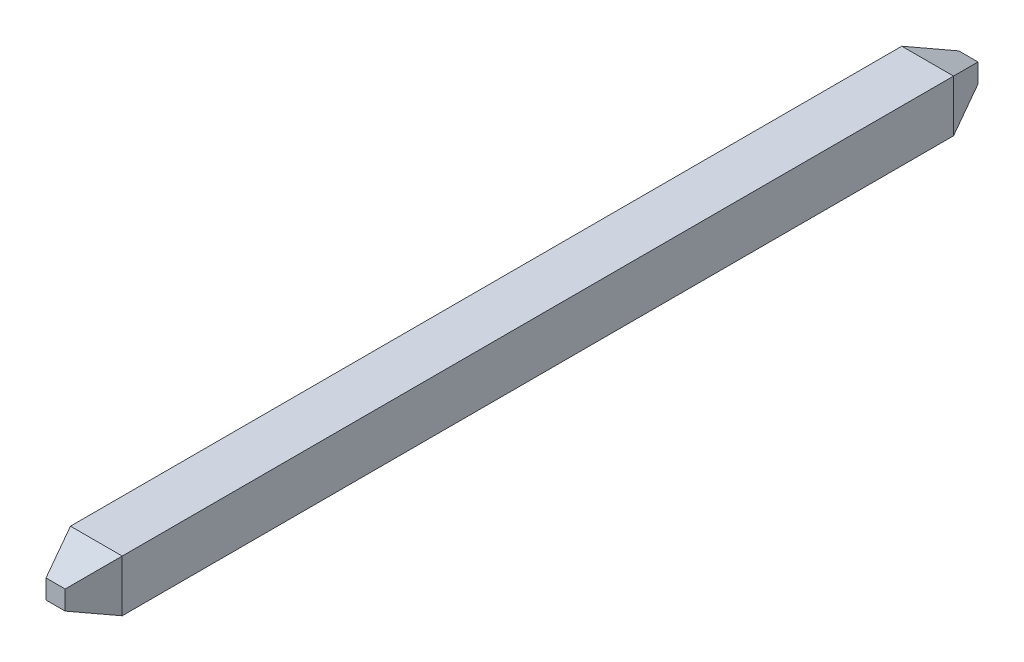
ISO-10303-21;
HEADER;
FILE_DESCRIPTION(('STEP AP214'),'2;1');
FILE_NAME('part.step','',(''),(''),'','','');
FILE_SCHEMA(('AUTOMOTIVE_DESIGN { 1 0 10303 214 1 1 1 1 }'));
ENDSEC;
DATA;
#1=APPLICATION_CONTEXT('core data for automotive mechanical design processes');
#2=APPLICATION_PROTOCOL_DEFINITION('international standard','automotive_design',2000,#1);
#3=PRODUCT_CONTEXT('',#1,'mechanical');
#4=PRODUCT('Part','Part','',(#3));
#5=PRODUCT_RELATED_PRODUCT_CATEGORY('part','',(#4));
#6=PRODUCT_DEFINITION_FORMATION('','',#4);
#7=PRODUCT_DEFINITION_CONTEXT('part definition',#1,'design');
#8=PRODUCT_DEFINITION('design','',#6,#7);
#9=PRODUCT_DEFINITION_SHAPE('','',#8);
#10=(LENGTH_UNIT() NAMED_UNIT(*) SI_UNIT(.MILLI.,.METRE.));
#11=(NAMED_UNIT(*) PLANE_ANGLE_UNIT() SI_UNIT($,.RADIAN.));
#12=(NAMED_UNIT(*) SI_UNIT($,.STERADIAN.) SOLID_ANGLE_UNIT());
#13=UNCERTAINTY_MEASURE_WITH_UNIT(LENGTH_MEASURE(1.E-05),#10,'distance_accuracy_value','');
#14=(GEOMETRIC_REPRESENTATION_CONTEXT(3) GLOBAL_UNCERTAINTY_ASSIGNED_CONTEXT((#13)) GLOBAL_UNIT_ASSIGNED_CONTEXT((#10,
#11,#12)) REPRESENTATION_CONTEXT('',''));
#15=CARTESIAN_POINT('',(0.,0.,0.));
#16=DIRECTION('',(0.,0.,1.));
#17=DIRECTION('',(1.,0.,0.));
#18=AXIS2_PLACEMENT_3D('',#15,#16,#17);
#19=CARTESIAN_POINT('',(0.3175,-0.2175,10.95));
#20=DIRECTION('',(0.,-0.928476690885259,0.371390676354104));
#21=DIRECTION('',(0.,-0.371390676354104,-0.928476690885259));
#22=AXIS2_PLACEMENT_3D('',#19,#20,#21);
#23=PLANE('',#22);
#24=DIRECTION('',(1.,0.,0.));
#25=VECTOR('',#24,1.);
#26=CARTESIAN_POINT('',(0.3175,-0.3175,10.7));
#27=LINE('',#26,#25);
#28=CARTESIAN_POINT('',(0.3175,-0.3175,10.7));
#29=VERTEX_POINT('',#28);
#30=CARTESIAN_POINT('',(-0.3175,-0.3175,10.7));
#31=VERTEX_POINT('',#30);
#32=EDGE_CURVE('E105',#29,#31,#27,.F.);
#33=ORIENTED_EDGE('',*,*,#32,.F.);
#34=DIRECTION('',(0.348155311911396,-0.348155311911395,-0.870388279778489));
#35=VECTOR('',#34,1.);
#36=CARTESIAN_POINT('',(0.1175,-0.1175,11.2));
#37=LINE('',#36,#35);
#38=CARTESIAN_POINT('',(0.1175,-0.1175,11.2));
#39=VERTEX_POINT('',#38);
#40=EDGE_CURVE('E86',#39,#29,#37,.T.);
#41=ORIENTED_EDGE('',*,*,#40,.F.);
#42=DIRECTION('',(1.,0.,0.));
#43=VECTOR('',#42,1.);
#44=CARTESIAN_POINT('',(0.,-0.1175,11.2));
#45=LINE('',#44,#43);
#46=CARTESIAN_POINT('',(-0.1175,-0.1175,11.2));
#47=VERTEX_POINT('',#46);
#48=EDGE_CURVE('E20',#47,#39,#45,.T.);
#49=ORIENTED_EDGE('',*,*,#48,.F.);
#50=DIRECTION('',(0.348155311911396,0.348155311911395,0.870388279778489));
#51=VECTOR('',#50,1.);
#52=CARTESIAN_POINT('',(-0.3175,-0.3175,10.7));
#53=LINE('',#52,#51);
#54=EDGE_CURVE('E83',#31,#47,#53,.T.);
#55=ORIENTED_EDGE('',*,*,#54,.F.);
#56=EDGE_LOOP('',(#33,#41,#49,#55));
#57=FACE_BOUND('',#56,.T.);
#58=ADVANCED_FACE('F17',(#57),#23,.T.);
#59=CARTESIAN_POINT('',(0.3175,-0.2175,0.25));
#60=DIRECTION('',(0.,0.928476690885259,0.371390676354104));
#61=DIRECTION('',(0.,-0.371390676354104,0.928476690885259));
#62=AXIS2_PLACEMENT_3D('',#59,#60,#61);
#63=PLANE('',#62);
#64=DIRECTION('',(1.,0.,0.));
#65=VECTOR('',#64,1.);
#66=CARTESIAN_POINT('',(0.3175,-0.3175,0.5));
#67=LINE('',#66,#65);
#68=CARTESIAN_POINT('',(-0.3175,-0.3175,0.5));
#69=VERTEX_POINT('',#68);
#70=CARTESIAN_POINT('',(0.3175,-0.3175,0.5));
#71=VERTEX_POINT('',#70);
#72=EDGE_CURVE('E107',#69,#71,#67,.T.);
#73=ORIENTED_EDGE('',*,*,#72,.F.);
#74=DIRECTION('',(0.348155311911396,0.348155311911396,-0.870388279778489));
#75=VECTOR('',#74,1.);
#76=CARTESIAN_POINT('',(-0.3175,-0.3175,0.5));
#77=LINE('',#76,#75);
#78=CARTESIAN_POINT('',(-0.1175,-0.1175,0.));
#79=VERTEX_POINT('',#78);
#80=EDGE_CURVE('E119',#69,#79,#77,.T.);
#81=ORIENTED_EDGE('',*,*,#80,.T.);
#82=DIRECTION('',(1.,0.,0.));
#83=VECTOR('',#82,1.);
#84=CARTESIAN_POINT('',(0.,-0.1175,0.));
#85=LINE('',#84,#83);
#86=CARTESIAN_POINT('',(0.1175,-0.1175,0.));
#87=VERTEX_POINT('',#86);
#88=EDGE_CURVE('E110',#79,#87,#85,.T.);
#89=ORIENTED_EDGE('',*,*,#88,.T.);
#90=DIRECTION('',(0.348155311911396,-0.348155311911396,0.870388279778489));
#91=VECTOR('',#90,1.);
#92=CARTESIAN_POINT('',(0.1175,-0.1175,0.));
#93=LINE('',#92,#91);
#94=EDGE_CURVE('E115',#87,#71,#93,.T.);
#95=ORIENTED_EDGE('',*,*,#94,.T.);
#96=EDGE_LOOP('',(#73,#81,#89,#95));
#97=FACE_BOUND('',#96,.T.);
#98=ADVANCED_FACE('F184',(#97),#63,.F.);
#99=CARTESIAN_POINT('',(0.,0.,11.2));
#100=DIRECTION('',(0.,0.,1.));
#101=DIRECTION('',(1.,0.,0.));
#102=AXIS2_PLACEMENT_3D('',#99,#100,#101);
#103=PLANE('',#102);
#104=ORIENTED_EDGE('',*,*,#48,.T.);
#105=DIRECTION('',(0.,1.,0.));
#106=VECTOR('',#105,1.);
#107=CARTESIAN_POINT('',(0.1175,0.3175,11.2));
#108=LINE('',#107,#106);
#109=CARTESIAN_POINT('',(0.1175,0.1175,11.2));
#110=VERTEX_POINT('',#109);
#111=EDGE_CURVE('E100',#110,#39,#108,.F.);
#112=ORIENTED_EDGE('',*,*,#111,.F.);
#113=DIRECTION('',(1.,0.,0.));
#114=VECTOR('',#113,1.);
#115=CARTESIAN_POINT('',(-0.3175,0.1175,11.2));
#116=LINE('',#115,#114);
#117=CARTESIAN_POINT('',(-0.1175,0.1175,11.2));
#118=VERTEX_POINT('',#117);
#119=EDGE_CURVE('E92',#118,#110,#116,.T.);
#120=ORIENTED_EDGE('',*,*,#119,.F.);
#121=DIRECTION('',(0.,1.,0.));
#122=VECTOR('',#121,1.);
#123=CARTESIAN_POINT('',(-0.1175,-0.3175,11.2));
#124=LINE('',#123,#122);
#125=EDGE_CURVE('E88',#47,#118,#124,.T.);
#126=ORIENTED_EDGE('',*,*,#125,.F.);
#127=EDGE_LOOP('',(#104,#112,#120,#126));
#128=FACE_BOUND('',#127,.T.);
#129=ADVANCED_FACE('F90',(#128),#103,.T.);
#130=CARTESIAN_POINT('',(-0.2175,-0.3175,10.95));
#131=DIRECTION('',(-0.928476690885259,0.,0.371390676354104));
#132=DIRECTION('',(0.371390676354104,0.,0.928476690885259));
#133=AXIS2_PLACEMENT_3D('',#130,#131,#132);
#134=PLANE('',#133);
#135=DIRECTION('',(0.,1.,0.));
#136=VECTOR('',#135,1.);
#137=CARTESIAN_POINT('',(-0.3175,-0.3175,10.7));
#138=LINE('',#137,#136);
#139=CARTESIAN_POINT('',(-0.3175,0.3175,10.7));
#140=VERTEX_POINT('',#139);
#141=EDGE_CURVE('E98',#31,#140,#138,.T.);
#142=ORIENTED_EDGE('',*,*,#141,.F.);
#143=ORIENTED_EDGE('',*,*,#54,.T.);
#144=ORIENTED_EDGE('',*,*,#125,.T.);
#145=DIRECTION('',(0.348155311911395,-0.348155311911396,0.870388279778489));
#146=VECTOR('',#145,1.);
#147=CARTESIAN_POINT('',(-0.3175,0.3175,10.7));
#148=LINE('',#147,#146);
#149=EDGE_CURVE('E132',#140,#118,#148,.T.);
#150=ORIENTED_EDGE('',*,*,#149,.F.);
#151=EDGE_LOOP('',(#142,#143,#144,#150));
#152=FACE_BOUND('',#151,.T.);
#153=ADVANCED_FACE('F96',(#152),#134,.T.);
#154=CARTESIAN_POINT('',(0.2175,0.3175,10.95));
#155=DIRECTION('',(0.928476690885259,0.,0.371390676354104));
#156=DIRECTION('',(0.371390676354104,0.,-0.928476690885259));
#157=AXIS2_PLACEMENT_3D('',#154,#155,#156);
#158=PLANE('',#157);
#159=DIRECTION('',(0.,1.,0.));
#160=VECTOR('',#159,1.);
#161=CARTESIAN_POINT('',(0.3175,0.3175,10.7));
#162=LINE('',#161,#160);
#163=CARTESIAN_POINT('',(0.3175,0.3175,10.7));
#164=VERTEX_POINT('',#163);
#165=EDGE_CURVE('E134',#164,#29,#162,.F.);
#166=ORIENTED_EDGE('',*,*,#165,.F.);
#167=DIRECTION('',(0.348155311911395,0.348155311911396,-0.870388279778489));
#168=VECTOR('',#167,1.);
#169=CARTESIAN_POINT('',(0.1175,0.1175,11.2));
#170=LINE('',#169,#168);
#171=EDGE_CURVE('E129',#110,#164,#170,.T.);
#172=ORIENTED_EDGE('',*,*,#171,.F.);
#173=ORIENTED_EDGE('',*,*,#111,.T.);
#174=ORIENTED_EDGE('',*,*,#40,.T.);
#175=EDGE_LOOP('',(#166,#172,#173,#174));
#176=FACE_BOUND('',#175,.T.);
#177=ADVANCED_FACE('F180',(#176),#158,.T.);
#178=CARTESIAN_POINT('',(0.3175,-0.3175,0.));
#179=DIRECTION('',(0.,-1.,0.));
#180=DIRECTION('',(0.,0.,-1.));
#181=AXIS2_PLACEMENT_3D('',#178,#179,#180);
#182=PLANE('',#181);
#183=DIRECTION('',(0.,0.,1.));
#184=VECTOR('',#183,1.);
#185=CARTESIAN_POINT('',(-0.3175,-0.3175,0.));
#186=LINE('',#185,#184);
#187=EDGE_CURVE('E122',#69,#31,#186,.T.);
#188=ORIENTED_EDGE('',*,*,#187,.F.);
#189=ORIENTED_EDGE('',*,*,#72,.T.);
#190=DIRECTION('',(0.,0.,-1.));
#191=VECTOR('',#190,1.);
#192=CARTESIAN_POINT('',(0.3175,-0.3175,0.));
#193=LINE('',#192,#191);
#194=EDGE_CURVE('E137',#29,#71,#193,.T.);
#195=ORIENTED_EDGE('',*,*,#194,.F.);
#196=ORIENTED_EDGE('',*,*,#32,.T.);
#197=EDGE_LOOP('',(#188,#189,#195,#196));
#198=FACE_BOUND('',#197,.T.);
#199=ADVANCED_FACE('F182',(#198),#182,.T.);
#200=CARTESIAN_POINT('',(0.,0.,0.));
#201=DIRECTION('',(0.,0.,1.));
#202=DIRECTION('',(1.,0.,0.));
#203=AXIS2_PLACEMENT_3D('',#200,#201,#202);
#204=PLANE('',#203);
#205=ORIENTED_EDGE('',*,*,#88,.F.);
#206=DIRECTION('',(0.,1.,0.));
#207=VECTOR('',#206,1.);
#208=CARTESIAN_POINT('',(-0.1175,-0.3175,0.));
#209=LINE('',#208,#207);
#210=CARTESIAN_POINT('',(-0.1175,0.1175,0.));
#211=VERTEX_POINT('',#210);
#212=EDGE_CURVE('E117',#79,#211,#209,.T.);
#213=ORIENTED_EDGE('',*,*,#212,.T.);
#214=DIRECTION('',(1.,0.,0.));
#215=VECTOR('',#214,1.);
#216=CARTESIAN_POINT('',(-0.3175,0.1175,0.));
#217=LINE('',#216,#215);
#218=CARTESIAN_POINT('',(0.1175,0.1175,0.));
#219=VERTEX_POINT('',#218);
#220=EDGE_CURVE('E142',#211,#219,#217,.T.);
#221=ORIENTED_EDGE('',*,*,#220,.T.);
#222=DIRECTION('',(0.,1.,0.));
#223=VECTOR('',#222,1.);
#224=CARTESIAN_POINT('',(0.1175,0.3175,0.));
#225=LINE('',#224,#223);
#226=EDGE_CURVE('E112',#219,#87,#225,.F.);
#227=ORIENTED_EDGE('',*,*,#226,.T.);
#228=EDGE_LOOP('',(#205,#213,#221,#227));
#229=FACE_BOUND('',#228,.T.);
#230=ADVANCED_FACE('F187',(#229),#204,.F.);
#231=CARTESIAN_POINT('',(0.2175,0.3175,0.25));
#232=DIRECTION('',(-0.928476690885259,0.,0.371390676354104));
#233=DIRECTION('',(0.371390676354104,0.,0.928476690885259));
#234=AXIS2_PLACEMENT_3D('',#231,#232,#233);
#235=PLANE('',#234);
#236=DIRECTION('',(0.,1.,0.));
#237=VECTOR('',#236,1.);
#238=CARTESIAN_POINT('',(0.3175,0.3175,0.5));
#239=LINE('',#238,#237);
#240=CARTESIAN_POINT('',(0.3175,0.3175,0.5));
#241=VERTEX_POINT('',#240);
#242=EDGE_CURVE('E140',#71,#241,#239,.T.);
#243=ORIENTED_EDGE('',*,*,#242,.F.);
#244=ORIENTED_EDGE('',*,*,#94,.F.);
#245=ORIENTED_EDGE('',*,*,#226,.F.);
#246=DIRECTION('',(0.348155311911396,0.348155311911396,0.870388279778489));
#247=VECTOR('',#246,1.);
#248=CARTESIAN_POINT('',(0.1175,0.1175,0.));
#249=LINE('',#248,#247);
#250=EDGE_CURVE('E35',#219,#241,#249,.T.);
#251=ORIENTED_EDGE('',*,*,#250,.T.);
#252=EDGE_LOOP('',(#243,#244,#245,#251));
#253=FACE_BOUND('',#252,.T.);
#254=ADVANCED_FACE('F185',(#253),#235,.F.);
#255=CARTESIAN_POINT('',(-0.2175,-0.3175,0.25));
#256=DIRECTION('',(0.928476690885259,0.,0.371390676354104));
#257=DIRECTION('',(0.371390676354104,0.,-0.928476690885259));
#258=AXIS2_PLACEMENT_3D('',#255,#256,#257);
#259=PLANE('',#258);
#260=DIRECTION('',(0.,1.,0.));
#261=VECTOR('',#260,1.);
#262=CARTESIAN_POINT('',(-0.3175,-0.3175,0.5));
#263=LINE('',#262,#261);
#264=CARTESIAN_POINT('',(-0.3175,0.3175,0.5));
#265=VERTEX_POINT('',#264);
#266=EDGE_CURVE('E125',#265,#69,#263,.F.);
#267=ORIENTED_EDGE('',*,*,#266,.F.);
#268=DIRECTION('',(0.348155311911396,-0.348155311911396,-0.870388279778489));
#269=VECTOR('',#268,1.);
#270=CARTESIAN_POINT('',(-0.3175,0.3175,0.5));
#271=LINE('',#270,#269);
#272=EDGE_CURVE('E145',#265,#211,#271,.T.);
#273=ORIENTED_EDGE('',*,*,#272,.T.);
#274=ORIENTED_EDGE('',*,*,#212,.F.);
#275=ORIENTED_EDGE('',*,*,#80,.F.);
#276=EDGE_LOOP('',(#267,#273,#274,#275));
#277=FACE_BOUND('',#276,.T.);
#278=ADVANCED_FACE('F170',(#277),#259,.F.);
#279=CARTESIAN_POINT('',(-0.3175,-0.3175,0.));
#280=DIRECTION('',(-1.,0.,0.));
#281=DIRECTION('',(0.,0.,1.));
#282=AXIS2_PLACEMENT_3D('',#279,#280,#281);
#283=PLANE('',#282);
#284=DIRECTION('',(0.,0.,1.));
#285=VECTOR('',#284,1.);
#286=CARTESIAN_POINT('',(-0.3175,0.3175,0.));
#287=LINE('',#286,#285);
#288=EDGE_CURVE('E148',#265,#140,#287,.T.);
#289=ORIENTED_EDGE('',*,*,#288,.F.);
#290=ORIENTED_EDGE('',*,*,#266,.T.);
#291=ORIENTED_EDGE('',*,*,#187,.T.);
#292=ORIENTED_EDGE('',*,*,#141,.T.);
#293=EDGE_LOOP('',(#289,#290,#291,#292));
#294=FACE_BOUND('',#293,.T.);
#295=ADVANCED_FACE('F174',(#294),#283,.T.);
#296=CARTESIAN_POINT('',(-0.3175,0.2175,10.95));
#297=DIRECTION('',(0.,0.928476690885259,0.371390676354104));
#298=DIRECTION('',(0.,-0.371390676354104,0.928476690885259));
#299=AXIS2_PLACEMENT_3D('',#296,#297,#298);
#300=PLANE('',#299);
#301=DIRECTION('',(1.,0.,0.));
#302=VECTOR('',#301,1.);
#303=CARTESIAN_POINT('',(-0.3175,0.3175,10.7));
#304=LINE('',#303,#302);
#305=EDGE_CURVE('E151',#140,#164,#304,.T.);
#306=ORIENTED_EDGE('',*,*,#305,.F.);
#307=ORIENTED_EDGE('',*,*,#149,.T.);
#308=ORIENTED_EDGE('',*,*,#119,.T.);
#309=ORIENTED_EDGE('',*,*,#171,.T.);
#310=EDGE_LOOP('',(#306,#307,#308,#309));
#311=FACE_BOUND('',#310,.T.);
#312=ADVANCED_FACE('F177',(#311),#300,.T.);
#313=CARTESIAN_POINT('',(0.3175,0.3175,0.));
#314=DIRECTION('',(1.,0.,0.));
#315=DIRECTION('',(0.,0.,-1.));
#316=AXIS2_PLACEMENT_3D('',#313,#314,#315);
#317=PLANE('',#316);
#318=ORIENTED_EDGE('',*,*,#194,.T.);
#319=ORIENTED_EDGE('',*,*,#242,.T.);
#320=DIRECTION('',(0.,0.,1.));
#321=VECTOR('',#320,1.);
#322=CARTESIAN_POINT('',(0.3175,0.3175,0.));
#323=LINE('',#322,#321);
#324=EDGE_CURVE('E26',#164,#241,#323,.F.);
#325=ORIENTED_EDGE('',*,*,#324,.F.);
#326=ORIENTED_EDGE('',*,*,#165,.T.);
#327=EDGE_LOOP('',(#318,#319,#325,#326));
#328=FACE_BOUND('',#327,.T.);
#329=ADVANCED_FACE('F161',(#328),#317,.T.);
#330=CARTESIAN_POINT('',(-0.3175,0.2175,0.25));
#331=DIRECTION('',(0.,-0.928476690885259,0.371390676354104));
#332=DIRECTION('',(0.,-0.371390676354104,-0.928476690885259));
#333=AXIS2_PLACEMENT_3D('',#330,#331,#332);
#334=PLANE('',#333);
#335=DIRECTION('',(1.,0.,0.));
#336=VECTOR('',#335,1.);
#337=CARTESIAN_POINT('',(-0.3175,0.3175,0.5));
#338=LINE('',#337,#336);
#339=EDGE_CURVE('E11',#241,#265,#338,.F.);
#340=ORIENTED_EDGE('',*,*,#339,.F.);
#341=ORIENTED_EDGE('',*,*,#250,.F.);
#342=ORIENTED_EDGE('',*,*,#220,.F.);
#343=ORIENTED_EDGE('',*,*,#272,.F.);
#344=EDGE_LOOP('',(#340,#341,#342,#343));
#345=FACE_BOUND('',#344,.T.);
#346=ADVANCED_FACE('F166',(#345),#334,.F.);
#347=CARTESIAN_POINT('',(-0.3175,0.3175,0.));
#348=DIRECTION('',(0.,1.,0.));
#349=DIRECTION('',(0.,0.,1.));
#350=AXIS2_PLACEMENT_3D('',#347,#348,#349);
#351=PLANE('',#350);
#352=ORIENTED_EDGE('',*,*,#324,.T.);
#353=ORIENTED_EDGE('',*,*,#339,.T.);
#354=ORIENTED_EDGE('',*,*,#288,.T.);
#355=ORIENTED_EDGE('',*,*,#305,.T.);
#356=EDGE_LOOP('',(#352,#353,#354,#355));
#357=FACE_BOUND('',#356,.T.);
#358=ADVANCED_FACE('F157',(#357),#351,.T.);
#359=CLOSED_SHELL('',(#58,#98,#129,#153,#177,#199,#230,#254,#278,#295,#312,#329,#346,#358));
#360=MANIFOLD_SOLID_BREP('B1',#359);
#361=ADVANCED_BREP_SHAPE_REPRESENTATION('',(#18,#360),#14);
#362=SHAPE_DEFINITION_REPRESENTATION(#9,#361);
ENDSEC;
END-ISO-10303-21;
